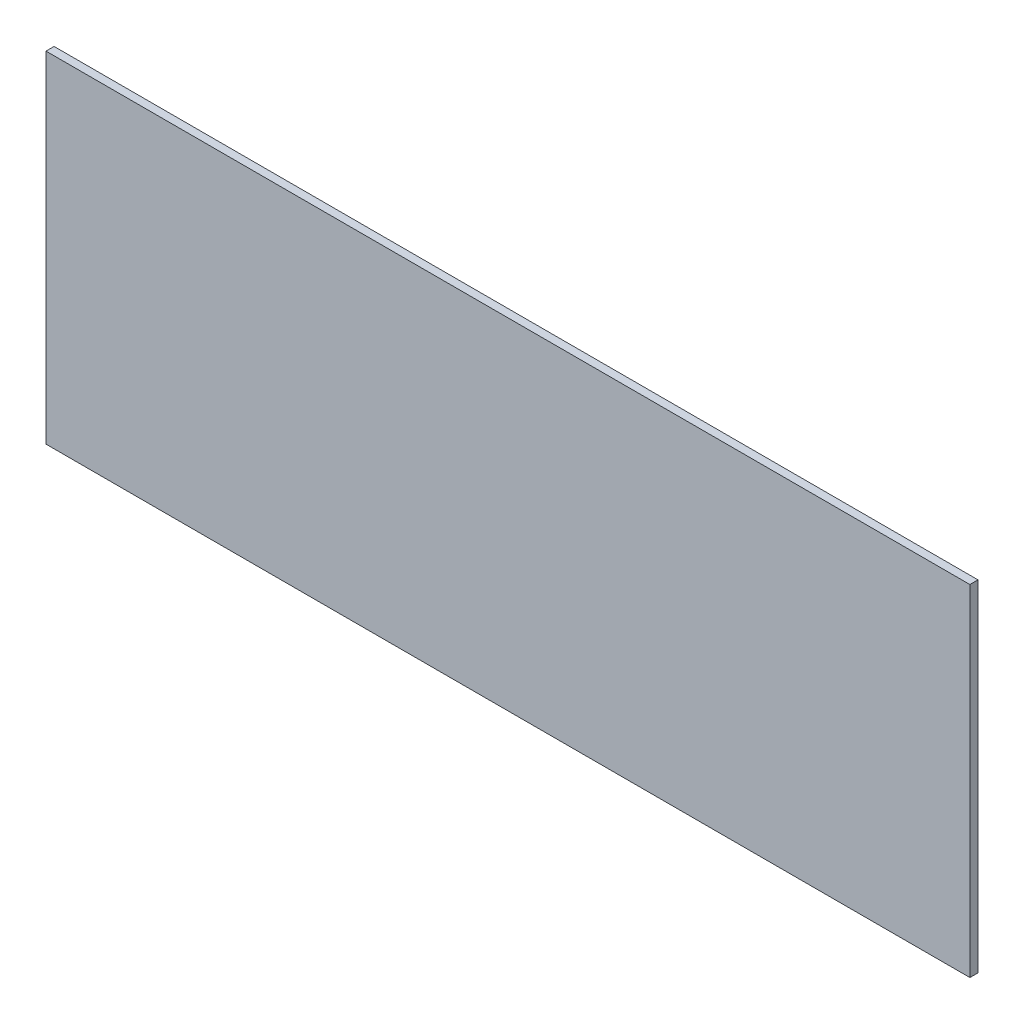
ISO-10303-21;
HEADER;
FILE_DESCRIPTION(('STEP AP214'),'2;1');
FILE_NAME('part.step','',(''),(''),'','','');
FILE_SCHEMA(('AUTOMOTIVE_DESIGN { 1 0 10303 214 1 1 1 1 }'));
ENDSEC;
DATA;
#1=APPLICATION_CONTEXT('core data for automotive mechanical design processes');
#2=APPLICATION_PROTOCOL_DEFINITION('international standard','automotive_design',2000,#1);
#3=PRODUCT_CONTEXT('',#1,'mechanical');
#4=PRODUCT('Part','Part','',(#3));
#5=PRODUCT_RELATED_PRODUCT_CATEGORY('part','',(#4));
#6=PRODUCT_DEFINITION_FORMATION('','',#4);
#7=PRODUCT_DEFINITION_CONTEXT('part definition',#1,'design');
#8=PRODUCT_DEFINITION('design','',#6,#7);
#9=PRODUCT_DEFINITION_SHAPE('','',#8);
#10=(LENGTH_UNIT() NAMED_UNIT(*) SI_UNIT(.MILLI.,.METRE.));
#11=(NAMED_UNIT(*) PLANE_ANGLE_UNIT() SI_UNIT($,.RADIAN.));
#12=(NAMED_UNIT(*) SI_UNIT($,.STERADIAN.) SOLID_ANGLE_UNIT());
#13=UNCERTAINTY_MEASURE_WITH_UNIT(LENGTH_MEASURE(1.E-05),#10,'distance_accuracy_value','');
#14=(GEOMETRIC_REPRESENTATION_CONTEXT(3) GLOBAL_UNCERTAINTY_ASSIGNED_CONTEXT((#13)) GLOBAL_UNIT_ASSIGNED_CONTEXT((#10,
#11,#12)) REPRESENTATION_CONTEXT('',''));
#15=CARTESIAN_POINT('',(0.,0.,0.));
#16=DIRECTION('',(0.,0.,1.));
#17=DIRECTION('',(1.,0.,0.));
#18=AXIS2_PLACEMENT_3D('',#15,#16,#17);
#19=CARTESIAN_POINT('',(-180.975,66.675,1.5875));
#20=DIRECTION('',(1.,0.,0.));
#21=DIRECTION('',(0.,0.,-1.));
#22=AXIS2_PLACEMENT_3D('',#19,#20,#21);
#23=PLANE('',#22);
#24=DIRECTION('',(0.,-1.,0.));
#25=VECTOR('',#24,1.);
#26=CARTESIAN_POINT('',(-180.975,66.675,-1.5875));
#27=LINE('',#26,#25);
#28=CARTESIAN_POINT('',(-180.975,66.675,-1.5875));
#29=VERTEX_POINT('',#28);
#30=CARTESIAN_POINT('',(-180.975,-66.675,-1.5875));
#31=VERTEX_POINT('',#30);
#32=EDGE_CURVE('E107',#29,#31,#27,.T.);
#33=ORIENTED_EDGE('',*,*,#32,.T.);
#34=DIRECTION('',(0.,0.,-1.));
#35=VECTOR('',#34,1.);
#36=CARTESIAN_POINT('',(-180.975,-66.675,1.5875));
#37=LINE('',#36,#35);
#38=CARTESIAN_POINT('',(-180.975,-66.675,1.5875));
#39=VERTEX_POINT('',#38);
#40=EDGE_CURVE('E11',#39,#31,#37,.T.);
#41=ORIENTED_EDGE('',*,*,#40,.F.);
#42=DIRECTION('',(0.,-1.,0.));
#43=VECTOR('',#42,1.);
#44=CARTESIAN_POINT('',(-180.975,66.675,1.5875));
#45=LINE('',#44,#43);
#46=CARTESIAN_POINT('',(-180.975,66.675,1.5875));
#47=VERTEX_POINT('',#46);
#48=EDGE_CURVE('E91',#47,#39,#45,.T.);
#49=ORIENTED_EDGE('',*,*,#48,.F.);
#50=DIRECTION('',(0.,0.,-1.));
#51=VECTOR('',#50,1.);
#52=CARTESIAN_POINT('',(-180.975,66.675,1.5875));
#53=LINE('',#52,#51);
#54=EDGE_CURVE('E103',#47,#29,#53,.T.);
#55=ORIENTED_EDGE('',*,*,#54,.T.);
#56=EDGE_LOOP('',(#33,#41,#49,#55));
#57=FACE_BOUND('',#56,.T.);
#58=ADVANCED_FACE('F39',(#57),#23,.F.);
#59=CARTESIAN_POINT('',(-180.975,-66.675,1.5875));
#60=DIRECTION('',(0.,1.,0.));
#61=DIRECTION('',(0.,0.,1.));
#62=AXIS2_PLACEMENT_3D('',#59,#60,#61);
#63=PLANE('',#62);
#64=DIRECTION('',(1.,0.,0.));
#65=VECTOR('',#64,1.);
#66=CARTESIAN_POINT('',(-180.975,-66.675,-1.5875));
#67=LINE('',#66,#65);
#68=CARTESIAN_POINT('',(180.975,-66.675,-1.5875));
#69=VERTEX_POINT('',#68);
#70=EDGE_CURVE('E96',#31,#69,#67,.T.);
#71=ORIENTED_EDGE('',*,*,#70,.T.);
#72=DIRECTION('',(0.,0.,-1.));
#73=VECTOR('',#72,1.);
#74=CARTESIAN_POINT('',(180.975,-66.675,1.5875));
#75=LINE('',#74,#73);
#76=CARTESIAN_POINT('',(180.975,-66.675,1.5875));
#77=VERTEX_POINT('',#76);
#78=EDGE_CURVE('E48',#77,#69,#75,.T.);
#79=ORIENTED_EDGE('',*,*,#78,.F.);
#80=DIRECTION('',(1.,0.,0.));
#81=VECTOR('',#80,1.);
#82=CARTESIAN_POINT('',(-180.975,-66.675,1.5875));
#83=LINE('',#82,#81);
#84=EDGE_CURVE('E86',#39,#77,#83,.T.);
#85=ORIENTED_EDGE('',*,*,#84,.F.);
#86=ORIENTED_EDGE('',*,*,#40,.T.);
#87=EDGE_LOOP('',(#71,#79,#85,#86));
#88=FACE_BOUND('',#87,.T.);
#89=ADVANCED_FACE('F95',(#88),#63,.F.);
#90=CARTESIAN_POINT('',(180.975,66.675,1.5875));
#91=DIRECTION('',(-1.,0.,0.));
#92=DIRECTION('',(0.,0.,1.));
#93=AXIS2_PLACEMENT_3D('',#90,#91,#92);
#94=PLANE('',#93);
#95=DIRECTION('',(0.,1.,0.));
#96=VECTOR('',#95,1.);
#97=CARTESIAN_POINT('',(180.975,66.675,-1.5875));
#98=LINE('',#97,#96);
#99=CARTESIAN_POINT('',(180.975,66.675,-1.5875));
#100=VERTEX_POINT('',#99);
#101=EDGE_CURVE('E73',#69,#100,#98,.T.);
#102=ORIENTED_EDGE('',*,*,#101,.T.);
#103=DIRECTION('',(0.,0.,-1.));
#104=VECTOR('',#103,1.);
#105=CARTESIAN_POINT('',(180.975,66.675,1.5875));
#106=LINE('',#105,#104);
#107=CARTESIAN_POINT('',(180.975,66.675,1.5875));
#108=VERTEX_POINT('',#107);
#109=EDGE_CURVE('E98',#108,#100,#106,.T.);
#110=ORIENTED_EDGE('',*,*,#109,.F.);
#111=DIRECTION('',(0.,1.,0.));
#112=VECTOR('',#111,1.);
#113=CARTESIAN_POINT('',(180.975,66.675,1.5875));
#114=LINE('',#113,#112);
#115=EDGE_CURVE('E89',#77,#108,#114,.T.);
#116=ORIENTED_EDGE('',*,*,#115,.F.);
#117=ORIENTED_EDGE('',*,*,#78,.T.);
#118=EDGE_LOOP('',(#102,#110,#116,#117));
#119=FACE_BOUND('',#118,.T.);
#120=ADVANCED_FACE('F99',(#119),#94,.F.);
#121=CARTESIAN_POINT('',(-180.975,66.675,1.5875));
#122=DIRECTION('',(0.,-1.,0.));
#123=DIRECTION('',(1.,0.,0.));
#124=AXIS2_PLACEMENT_3D('',#121,#122,#123);
#125=PLANE('',#124);
#126=DIRECTION('',(-1.,0.,0.));
#127=VECTOR('',#126,1.);
#128=CARTESIAN_POINT('',(-180.975,66.675,-1.5875));
#129=LINE('',#128,#127);
#130=EDGE_CURVE('E79',#100,#29,#129,.T.);
#131=ORIENTED_EDGE('',*,*,#130,.T.);
#132=ORIENTED_EDGE('',*,*,#54,.F.);
#133=DIRECTION('',(-1.,0.,0.));
#134=VECTOR('',#133,1.);
#135=CARTESIAN_POINT('',(-180.975,66.675,1.5875));
#136=LINE('',#135,#134);
#137=EDGE_CURVE('E56',#108,#47,#136,.T.);
#138=ORIENTED_EDGE('',*,*,#137,.F.);
#139=ORIENTED_EDGE('',*,*,#109,.T.);
#140=EDGE_LOOP('',(#131,#132,#138,#139));
#141=FACE_BOUND('',#140,.T.);
#142=ADVANCED_FACE('F120',(#141),#125,.F.);
#143=CARTESIAN_POINT('',(0.,0.,1.5875));
#144=DIRECTION('',(0.,0.,1.));
#145=DIRECTION('',(1.,0.,0.));
#146=AXIS2_PLACEMENT_3D('',#143,#144,#145);
#147=PLANE('',#146);
#148=ORIENTED_EDGE('',*,*,#48,.T.);
#149=ORIENTED_EDGE('',*,*,#84,.T.);
#150=ORIENTED_EDGE('',*,*,#115,.T.);
#151=ORIENTED_EDGE('',*,*,#137,.T.);
#152=EDGE_LOOP('',(#148,#149,#150,#151));
#153=FACE_BOUND('',#152,.T.);
#154=ADVANCED_FACE('F87',(#153),#147,.T.);
#155=CARTESIAN_POINT('',(0.,0.,-1.5875));
#156=DIRECTION('',(0.,0.,1.));
#157=DIRECTION('',(1.,0.,0.));
#158=AXIS2_PLACEMENT_3D('',#155,#156,#157);
#159=PLANE('',#158);
#160=ORIENTED_EDGE('',*,*,#32,.F.);
#161=ORIENTED_EDGE('',*,*,#130,.F.);
#162=ORIENTED_EDGE('',*,*,#101,.F.);
#163=ORIENTED_EDGE('',*,*,#70,.F.);
#164=EDGE_LOOP('',(#160,#161,#162,#163));
#165=FACE_BOUND('',#164,.T.);
#166=ADVANCED_FACE('F123',(#165),#159,.F.);
#167=CLOSED_SHELL('',(#58,#89,#120,#142,#154,#166));
#168=MANIFOLD_SOLID_BREP('B2',#167);
#169=ADVANCED_BREP_SHAPE_REPRESENTATION('',(#18,#168),#14);
#170=SHAPE_DEFINITION_REPRESENTATION(#9,#169);
ENDSEC;
END-ISO-10303-21;
